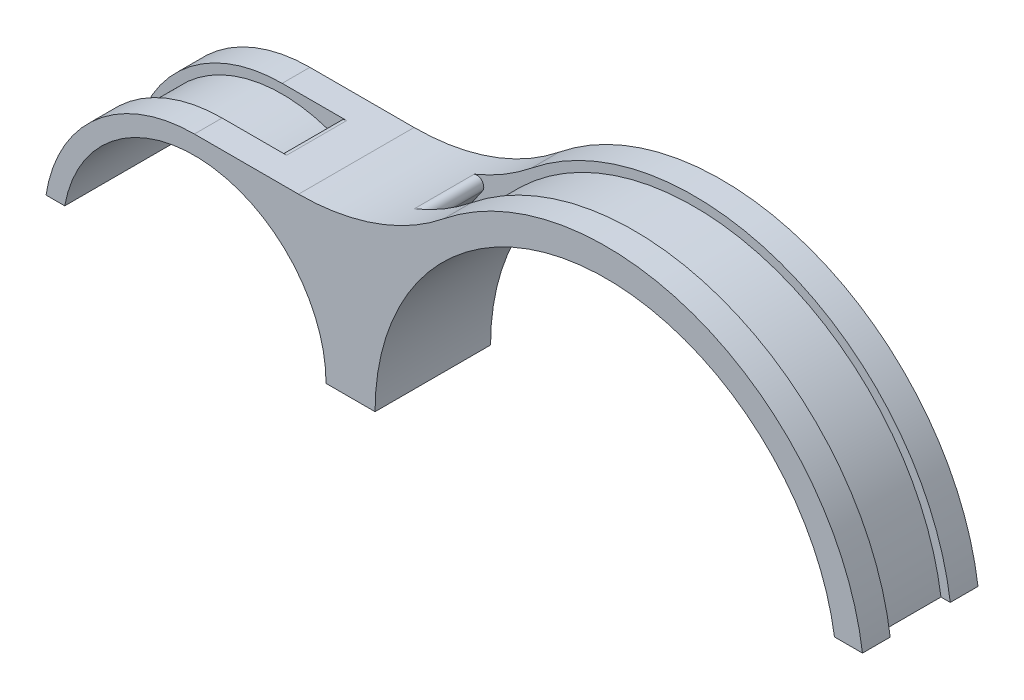
ISO-10303-21;
HEADER;
FILE_DESCRIPTION(('STEP AP214'),'2;1');
FILE_NAME('part.step','',(''),(''),'','','');
FILE_SCHEMA(('AUTOMOTIVE_DESIGN { 1 0 10303 214 1 1 1 1 }'));
ENDSEC;
DATA;
#1=APPLICATION_CONTEXT('core data for automotive mechanical design processes');
#2=APPLICATION_PROTOCOL_DEFINITION('international standard','automotive_design',2000,#1);
#3=PRODUCT_CONTEXT('',#1,'mechanical');
#4=PRODUCT('Part','Part','',(#3));
#5=PRODUCT_RELATED_PRODUCT_CATEGORY('part','',(#4));
#6=PRODUCT_DEFINITION_FORMATION('','',#4);
#7=PRODUCT_DEFINITION_CONTEXT('part definition',#1,'design');
#8=PRODUCT_DEFINITION('design','',#6,#7);
#9=PRODUCT_DEFINITION_SHAPE('','',#8);
#10=(LENGTH_UNIT() NAMED_UNIT(*) SI_UNIT(.MILLI.,.METRE.));
#11=(NAMED_UNIT(*) PLANE_ANGLE_UNIT() SI_UNIT($,.RADIAN.));
#12=(NAMED_UNIT(*) SI_UNIT($,.STERADIAN.) SOLID_ANGLE_UNIT());
#13=UNCERTAINTY_MEASURE_WITH_UNIT(LENGTH_MEASURE(1.E-05),#10,'distance_accuracy_value','');
#14=(GEOMETRIC_REPRESENTATION_CONTEXT(3) GLOBAL_UNCERTAINTY_ASSIGNED_CONTEXT((#13)) GLOBAL_UNIT_ASSIGNED_CONTEXT((#10,
#11,#12)) REPRESENTATION_CONTEXT('',''));
#15=CARTESIAN_POINT('',(0.,0.,0.));
#16=DIRECTION('',(0.,0.,1.));
#17=DIRECTION('',(1.,0.,0.));
#18=AXIS2_PLACEMENT_3D('',#15,#16,#17);
#19=CARTESIAN_POINT('',(0.,0.,12.5));
#20=DIRECTION('',(0.,0.,1.));
#21=DIRECTION('',(1.,0.,0.));
#22=AXIS2_PLACEMENT_3D('',#19,#20,#21);
#23=PLANE('',#22);
#24=CARTESIAN_POINT('',(-89.1042761152943,0.,12.5));
#25=DIRECTION('',(0.,0.,1.));
#26=DIRECTION('',(1.,0.,0.));
#27=AXIS2_PLACEMENT_3D('',#24,#25,#26);
#28=CIRCLE('',#27,28.5);
#29=CARTESIAN_POINT('',(-60.6042761152943,0.,12.5));
#30=VERTEX_POINT('',#29);
#31=CARTESIAN_POINT('',(-117.162251808491,5.,12.5));
#32=VERTEX_POINT('',#31);
#33=EDGE_CURVE('E220',#30,#32,#28,.T.);
#34=ORIENTED_EDGE('',*,*,#33,.F.);
#35=DIRECTION('',(1.,0.,0.));
#36=VECTOR('',#35,1.);
#37=CARTESIAN_POINT('',(0.,0.,12.5));
#38=LINE('',#37,#36);
#39=CARTESIAN_POINT('',(-50.,0.,12.5));
#40=VERTEX_POINT('',#39);
#41=EDGE_CURVE('E50',#30,#40,#38,.T.);
#42=ORIENTED_EDGE('',*,*,#41,.T.);
#43=CARTESIAN_POINT('',(0.,0.,12.5));
#44=DIRECTION('',(0.,0.,1.));
#45=DIRECTION('',(1.,0.,0.));
#46=AXIS2_PLACEMENT_3D('',#43,#44,#45);
#47=CIRCLE('',#46,50.);
#48=CARTESIAN_POINT('',(49.434299833213,7.5,12.5));
#49=VERTEX_POINT('',#48);
#50=EDGE_CURVE('E251',#49,#40,#47,.T.);
#51=ORIENTED_EDGE('',*,*,#50,.F.);
#52=DIRECTION('',(-1.,0.,0.));
#53=VECTOR('',#52,1.);
#54=CARTESIAN_POINT('',(56.,7.5,12.5));
#55=LINE('',#54,#53);
#56=CARTESIAN_POINT('',(55.4954953126828,7.5,12.5));
#57=VERTEX_POINT('',#56);
#58=EDGE_CURVE('E379',#57,#49,#55,.T.);
#59=ORIENTED_EDGE('',*,*,#58,.F.);
#60=CARTESIAN_POINT('',(0.,0.,12.5));
#61=DIRECTION('',(0.,0.,1.));
#62=DIRECTION('',(1.,0.,0.));
#63=AXIS2_PLACEMENT_3D('',#60,#61,#62);
#64=CIRCLE('',#63,56.);
#65=CARTESIAN_POINT('',(-35.1618543108296,43.5849056603773,12.5));
#66=VERTEX_POINT('',#65);
#67=EDGE_CURVE('E257',#57,#66,#64,.T.);
#68=ORIENTED_EDGE('',*,*,#67,.T.);
#69=CARTESIAN_POINT('',(-66.5563670883561,82.5,12.5));
#70=DIRECTION('',(0.,0.,1.));
#71=DIRECTION('',(1.,0.,0.));
#72=AXIS2_PLACEMENT_3D('',#69,#70,#71);
#73=CIRCLE('',#72,50.);
#74=CARTESIAN_POINT('',(-66.5563670883561,32.5,12.5));
#75=VERTEX_POINT('',#74);
#76=EDGE_CURVE('E277',#66,#75,#73,.F.);
#77=ORIENTED_EDGE('',*,*,#76,.T.);
#78=DIRECTION('',(-1.,0.,0.));
#79=VECTOR('',#78,1.);
#80=CARTESIAN_POINT('',(-45.6042761152943,32.5,12.5));
#81=LINE('',#80,#79);
#82=CARTESIAN_POINT('',(-89.1042761152943,32.5,12.5));
#83=VERTEX_POINT('',#82);
#84=EDGE_CURVE('E246',#75,#83,#81,.T.);
#85=ORIENTED_EDGE('',*,*,#84,.T.);
#86=CARTESIAN_POINT('',(-89.1042761152943,0.,12.5));
#87=DIRECTION('',(0.,0.,1.));
#88=DIRECTION('',(1.,0.,0.));
#89=AXIS2_PLACEMENT_3D('',#86,#87,#88);
#90=CIRCLE('',#89,32.5);
#91=CARTESIAN_POINT('',(-121.217357561957,5.,12.5));
#92=VERTEX_POINT('',#91);
#93=EDGE_CURVE('E242',#83,#92,#90,.T.);
#94=ORIENTED_EDGE('',*,*,#93,.T.);
#95=DIRECTION('',(1.,0.,0.));
#96=VECTOR('',#95,1.);
#97=CARTESIAN_POINT('',(-117.162251808491,5.,12.5));
#98=LINE('',#97,#96);
#99=EDGE_CURVE('E333',#92,#32,#98,.T.);
#100=ORIENTED_EDGE('',*,*,#99,.T.);
#101=EDGE_LOOP('',(#34,#42,#51,#59,#68,#77,#85,#94,#100));
#102=FACE_BOUND('',#101,.T.);
#103=ADVANCED_FACE('F35',(#102),#23,.T.);
#104=CARTESIAN_POINT('',(0.,0.,-12.5));
#105=DIRECTION('',(0.,0.,1.));
#106=DIRECTION('',(1.,0.,0.));
#107=AXIS2_PLACEMENT_3D('',#104,#105,#106);
#108=PLANE('',#107);
#109=DIRECTION('',(1.,0.,0.));
#110=VECTOR('',#109,1.);
#111=CARTESIAN_POINT('',(0.,0.,-12.5));
#112=LINE('',#111,#110);
#113=CARTESIAN_POINT('',(-60.6042761152943,0.,-12.5));
#114=VERTEX_POINT('',#113);
#115=CARTESIAN_POINT('',(-50.,0.,-12.5));
#116=VERTEX_POINT('',#115);
#117=EDGE_CURVE('E385',#114,#116,#112,.T.);
#118=ORIENTED_EDGE('',*,*,#117,.F.);
#119=CARTESIAN_POINT('',(-89.1042761152943,0.,-12.5));
#120=DIRECTION('',(0.,0.,1.));
#121=DIRECTION('',(1.,0.,0.));
#122=AXIS2_PLACEMENT_3D('',#119,#120,#121);
#123=CIRCLE('',#122,28.5);
#124=CARTESIAN_POINT('',(-117.162251808491,5.,-12.5));
#125=VERTEX_POINT('',#124);
#126=EDGE_CURVE('E222',#114,#125,#123,.T.);
#127=ORIENTED_EDGE('',*,*,#126,.T.);
#128=DIRECTION('',(1.,0.,0.));
#129=VECTOR('',#128,1.);
#130=CARTESIAN_POINT('',(-117.162251808491,5.,-12.5));
#131=LINE('',#130,#129);
#132=CARTESIAN_POINT('',(-121.217357561957,5.,-12.5));
#133=VERTEX_POINT('',#132);
#134=EDGE_CURVE('E348',#133,#125,#131,.T.);
#135=ORIENTED_EDGE('',*,*,#134,.F.);
#136=CARTESIAN_POINT('',(-89.1042761152943,0.,-12.5));
#137=DIRECTION('',(0.,0.,1.));
#138=DIRECTION('',(1.,0.,0.));
#139=AXIS2_PLACEMENT_3D('',#136,#137,#138);
#140=CIRCLE('',#139,32.5);
#141=CARTESIAN_POINT('',(-89.1042761152943,32.5,-12.5));
#142=VERTEX_POINT('',#141);
#143=EDGE_CURVE('E236',#133,#142,#140,.F.);
#144=ORIENTED_EDGE('',*,*,#143,.T.);
#145=DIRECTION('',(1.,0.,0.));
#146=VECTOR('',#145,1.);
#147=CARTESIAN_POINT('',(-45.6042761152943,32.5,-12.5));
#148=LINE('',#147,#146);
#149=CARTESIAN_POINT('',(-66.5563670883561,32.5,-12.5));
#150=VERTEX_POINT('',#149);
#151=EDGE_CURVE('E238',#142,#150,#148,.T.);
#152=ORIENTED_EDGE('',*,*,#151,.T.);
#153=CARTESIAN_POINT('',(-66.5563670883561,82.5,-12.5));
#154=DIRECTION('',(0.,0.,1.));
#155=DIRECTION('',(1.,0.,0.));
#156=AXIS2_PLACEMENT_3D('',#153,#154,#155);
#157=CIRCLE('',#156,50.);
#158=CARTESIAN_POINT('',(-35.1618543108296,43.5849056603773,-12.5));
#159=VERTEX_POINT('',#158);
#160=EDGE_CURVE('E269',#150,#159,#157,.T.);
#161=ORIENTED_EDGE('',*,*,#160,.T.);
#162=CARTESIAN_POINT('',(0.,0.,-12.5));
#163=DIRECTION('',(0.,0.,1.));
#164=DIRECTION('',(1.,0.,0.));
#165=AXIS2_PLACEMENT_3D('',#162,#163,#164);
#166=CIRCLE('',#165,56.);
#167=CARTESIAN_POINT('',(55.4954953126828,7.5,-12.5));
#168=VERTEX_POINT('',#167);
#169=EDGE_CURVE('E254',#168,#159,#166,.T.);
#170=ORIENTED_EDGE('',*,*,#169,.F.);
#171=DIRECTION('',(-1.,0.,0.));
#172=VECTOR('',#171,1.);
#173=CARTESIAN_POINT('',(56.,7.5,-12.5));
#174=LINE('',#173,#172);
#175=CARTESIAN_POINT('',(49.434299833213,7.5,-12.5));
#176=VERTEX_POINT('',#175);
#177=EDGE_CURVE('E376',#168,#176,#174,.T.);
#178=ORIENTED_EDGE('',*,*,#177,.T.);
#179=CARTESIAN_POINT('',(0.,0.,-12.5));
#180=DIRECTION('',(0.,0.,1.));
#181=DIRECTION('',(1.,0.,0.));
#182=AXIS2_PLACEMENT_3D('',#179,#180,#181);
#183=CIRCLE('',#182,50.);
#184=EDGE_CURVE('E245',#176,#116,#183,.T.);
#185=ORIENTED_EDGE('',*,*,#184,.T.);
#186=EDGE_LOOP('',(#118,#127,#135,#144,#152,#161,#170,#178,#185));
#187=FACE_BOUND('',#186,.T.);
#188=ADVANCED_FACE('F343',(#187),#108,.F.);
#189=CARTESIAN_POINT('',(0.,0.,12.5));
#190=DIRECTION('',(0.,0.,-1.));
#191=DIRECTION('',(-1.,0.,0.));
#192=AXIS2_PLACEMENT_3D('',#189,#190,#191);
#193=CYLINDRICAL_SURFACE('',#192,50.);
#194=ORIENTED_EDGE('',*,*,#50,.T.);
#195=DIRECTION('',(0.,0.,-1.));
#196=VECTOR('',#195,1.);
#197=CARTESIAN_POINT('',(-50.,0.,12.5));
#198=LINE('',#197,#196);
#199=EDGE_CURVE('E381',#40,#116,#198,.T.);
#200=ORIENTED_EDGE('',*,*,#199,.T.);
#201=ORIENTED_EDGE('',*,*,#184,.F.);
#202=DIRECTION('',(0.,0.,-1.));
#203=VECTOR('',#202,1.);
#204=CARTESIAN_POINT('',(49.434299833213,7.5,12.5));
#205=LINE('',#204,#203);
#206=EDGE_CURVE('E363',#176,#49,#205,.F.);
#207=ORIENTED_EDGE('',*,*,#206,.T.);
#208=EDGE_LOOP('',(#194,#200,#201,#207));
#209=FACE_BOUND('',#208,.T.);
#210=ADVANCED_FACE('F402',(#209),#193,.F.);
#211=CARTESIAN_POINT('',(0.,0.,-6.5));
#212=DIRECTION('',(0.,0.,1.));
#213=DIRECTION('',(1.,0.,0.));
#214=AXIS2_PLACEMENT_3D('',#211,#212,#213);
#215=PLANE('',#214);
#216=CARTESIAN_POINT('',(-89.1042761152943,0.,-6.5));
#217=DIRECTION('',(0.,0.,1.));
#218=DIRECTION('',(1.,0.,0.));
#219=AXIS2_PLACEMENT_3D('',#216,#217,#218);
#220=CIRCLE('',#219,30.5);
#221=CARTESIAN_POINT('',(-58.6042761152943,0.,-6.5));
#222=VERTEX_POINT('',#221);
#223=CARTESIAN_POINT('',(-119.191648881955,5.,-6.5));
#224=VERTEX_POINT('',#223);
#225=EDGE_CURVE('E201',#222,#224,#220,.T.);
#226=ORIENTED_EDGE('',*,*,#225,.F.);
#227=DIRECTION('',(1.,0.,0.));
#228=VECTOR('',#227,1.);
#229=CARTESIAN_POINT('',(0.,0.,-6.5));
#230=LINE('',#229,#228);
#231=CARTESIAN_POINT('',(-54.,0.,-6.5));
#232=VERTEX_POINT('',#231);
#233=EDGE_CURVE('E58',#222,#232,#230,.T.);
#234=ORIENTED_EDGE('',*,*,#233,.T.);
#235=CARTESIAN_POINT('',(0.,0.,-6.5));
#236=DIRECTION('',(0.,0.,1.));
#237=DIRECTION('',(1.,0.,0.));
#238=AXIS2_PLACEMENT_3D('',#235,#236,#237);
#239=CIRCLE('',#238,54.);
#240=CARTESIAN_POINT('',(53.4766304099277,7.5,-6.5));
#241=VERTEX_POINT('',#240);
#242=EDGE_CURVE('E224',#241,#232,#239,.T.);
#243=ORIENTED_EDGE('',*,*,#242,.F.);
#244=DIRECTION('',(1.,0.,0.));
#245=VECTOR('',#244,1.);
#246=CARTESIAN_POINT('',(0.,7.5,-6.5));
#247=LINE('',#246,#245);
#248=CARTESIAN_POINT('',(55.4954953126828,7.5,-6.5));
#249=VERTEX_POINT('',#248);
#250=EDGE_CURVE('E371',#241,#249,#247,.T.);
#251=ORIENTED_EDGE('',*,*,#250,.T.);
#252=CARTESIAN_POINT('',(0.,0.,-6.5));
#253=DIRECTION('',(0.,0.,1.));
#254=DIRECTION('',(1.,0.,0.));
#255=AXIS2_PLACEMENT_3D('',#252,#253,#254);
#256=CIRCLE('',#255,56.);
#257=CARTESIAN_POINT('',(-35.1618543108296,43.5849056603773,-6.5));
#258=VERTEX_POINT('',#257);
#259=EDGE_CURVE('E234',#249,#258,#256,.T.);
#260=ORIENTED_EDGE('',*,*,#259,.T.);
#261=CARTESIAN_POINT('',(-66.5563670883561,82.5,-6.5));
#262=DIRECTION('',(0.,0.,1.));
#263=DIRECTION('',(1.,0.,0.));
#264=AXIS2_PLACEMENT_3D('',#261,#262,#263);
#265=CIRCLE('',#264,50.);
#266=CARTESIAN_POINT('',(-47.5428205284511,36.2562431541908,-6.5));
#267=VERTEX_POINT('',#266);
#268=EDGE_CURVE('E272',#258,#267,#265,.F.);
#269=ORIENTED_EDGE('',*,*,#268,.T.);
#270=CARTESIAN_POINT('',(-46.9724141316539,34.8689304488165,-6.5));
#271=DIRECTION('',(0.,0.,1.));
#272=DIRECTION('',(1.,0.,0.));
#273=AXIS2_PLACEMENT_3D('',#270,#271,#272);
#274=CIRCLE('',#273,1.5);
#275=CARTESIAN_POINT('',(-45.7679932564833,33.9748553091032,-6.5));
#276=VERTEX_POINT('',#275);
#277=EDGE_CURVE('E302',#267,#276,#274,.F.);
#278=ORIENTED_EDGE('',*,*,#277,.T.);
#279=CARTESIAN_POINT('',(0.,0.,-6.5));
#280=DIRECTION('',(0.,0.,1.));
#281=DIRECTION('',(1.,0.,0.));
#282=AXIS2_PLACEMENT_3D('',#279,#280,#281);
#283=CIRCLE('',#282,57.);
#284=CARTESIAN_POINT('',(-56.8565419291445,4.04148980691904,-6.5));
#285=VERTEX_POINT('',#284);
#286=EDGE_CURVE('E229',#276,#285,#283,.T.);
#287=ORIENTED_EDGE('',*,*,#286,.T.);
#288=CARTESIAN_POINT('',(-89.1042761152943,0.,-6.5));
#289=DIRECTION('',(0.,0.,1.));
#290=DIRECTION('',(1.,0.,0.));
#291=AXIS2_PLACEMENT_3D('',#288,#289,#290);
#292=CIRCLE('',#291,32.5);
#293=CARTESIAN_POINT('',(-75.756105485221,29.6323529411765,-6.5));
#294=VERTEX_POINT('',#293);
#295=EDGE_CURVE('E210',#285,#294,#292,.T.);
#296=ORIENTED_EDGE('',*,*,#295,.T.);
#297=CARTESIAN_POINT('',(-75.1400360715253,31.,-6.5));
#298=DIRECTION('',(0.,0.,1.));
#299=DIRECTION('',(1.,0.,0.));
#300=AXIS2_PLACEMENT_3D('',#297,#298,#299);
#301=CIRCLE('',#300,1.5);
#302=CARTESIAN_POINT('',(-75.1400360715253,32.5,-6.5));
#303=VERTEX_POINT('',#302);
#304=EDGE_CURVE('E43',#294,#303,#301,.F.);
#305=ORIENTED_EDGE('',*,*,#304,.T.);
#306=DIRECTION('',(1.,0.,0.));
#307=VECTOR('',#306,1.);
#308=CARTESIAN_POINT('',(0.,32.5,-6.5));
#309=LINE('',#308,#307);
#310=CARTESIAN_POINT('',(-89.1042761152943,32.5,-6.5));
#311=VERTEX_POINT('',#310);
#312=EDGE_CURVE('E289',#311,#303,#309,.T.);
#313=ORIENTED_EDGE('',*,*,#312,.F.);
#314=CARTESIAN_POINT('',(-121.217357561957,5.,-6.5));
#315=VERTEX_POINT('',#314);
#316=EDGE_CURVE('E214',#311,#315,#292,.T.);
#317=ORIENTED_EDGE('',*,*,#316,.T.);
#318=DIRECTION('',(-1.,0.,0.));
#319=VECTOR('',#318,1.);
#320=CARTESIAN_POINT('',(0.,5.,-6.5));
#321=LINE('',#320,#319);
#322=EDGE_CURVE('E352',#224,#315,#321,.T.);
#323=ORIENTED_EDGE('',*,*,#322,.F.);
#324=EDGE_LOOP('',(#226,#234,#243,#251,#260,#269,#278,#287,#296,#305,#313,#317,#323));
#325=FACE_BOUND('',#324,.T.);
#326=ADVANCED_FACE('F307',(#325),#215,.T.);
#327=CARTESIAN_POINT('',(0.,0.,6.5));
#328=DIRECTION('',(0.,0.,1.));
#329=DIRECTION('',(1.,0.,0.));
#330=AXIS2_PLACEMENT_3D('',#327,#328,#329);
#331=PLANE('',#330);
#332=DIRECTION('',(1.,0.,0.));
#333=VECTOR('',#332,1.);
#334=CARTESIAN_POINT('',(0.,0.,6.5));
#335=LINE('',#334,#333);
#336=CARTESIAN_POINT('',(-58.6042761152943,0.,6.5));
#337=VERTEX_POINT('',#336);
#338=CARTESIAN_POINT('',(-54.,0.,6.5));
#339=VERTEX_POINT('',#338);
#340=EDGE_CURVE('E182',#337,#339,#335,.T.);
#341=ORIENTED_EDGE('',*,*,#340,.F.);
#342=CARTESIAN_POINT('',(-89.1042761152943,0.,6.5));
#343=DIRECTION('',(0.,0.,1.));
#344=DIRECTION('',(1.,0.,0.));
#345=AXIS2_PLACEMENT_3D('',#342,#343,#344);
#346=CIRCLE('',#345,30.5);
#347=CARTESIAN_POINT('',(-119.191648881955,5.,6.5));
#348=VERTEX_POINT('',#347);
#349=EDGE_CURVE('E191',#337,#348,#346,.T.);
#350=ORIENTED_EDGE('',*,*,#349,.T.);
#351=DIRECTION('',(-1.,0.,0.));
#352=VECTOR('',#351,1.);
#353=CARTESIAN_POINT('',(0.,5.,6.5));
#354=LINE('',#353,#352);
#355=CARTESIAN_POINT('',(-121.217357561957,5.,6.5));
#356=VERTEX_POINT('',#355);
#357=EDGE_CURVE('E354',#348,#356,#354,.T.);
#358=ORIENTED_EDGE('',*,*,#357,.T.);
#359=CARTESIAN_POINT('',(-89.1042761152943,0.,6.5));
#360=DIRECTION('',(0.,0.,1.));
#361=DIRECTION('',(1.,0.,0.));
#362=AXIS2_PLACEMENT_3D('',#359,#360,#361);
#363=CIRCLE('',#362,32.5);
#364=CARTESIAN_POINT('',(-89.1042761152943,32.5,6.5));
#365=VERTEX_POINT('',#364);
#366=EDGE_CURVE('E204',#365,#356,#363,.T.);
#367=ORIENTED_EDGE('',*,*,#366,.F.);
#368=DIRECTION('',(-1.,0.,0.));
#369=VECTOR('',#368,1.);
#370=CARTESIAN_POINT('',(-45.6042761152943,32.5,6.50000000000001));
#371=LINE('',#370,#369);
#372=CARTESIAN_POINT('',(-75.1400360715253,32.5,6.5));
#373=VERTEX_POINT('',#372);
#374=EDGE_CURVE('E295',#373,#365,#371,.T.);
#375=ORIENTED_EDGE('',*,*,#374,.F.);
#376=CARTESIAN_POINT('',(-75.1400360715253,31.,6.5));
#377=DIRECTION('',(0.,0.,1.));
#378=DIRECTION('',(1.,0.,0.));
#379=AXIS2_PLACEMENT_3D('',#376,#377,#378);
#380=CIRCLE('',#379,1.5);
#381=CARTESIAN_POINT('',(-75.756105485221,29.6323529411765,6.5));
#382=VERTEX_POINT('',#381);
#383=EDGE_CURVE('E304',#373,#382,#380,.T.);
#384=ORIENTED_EDGE('',*,*,#383,.T.);
#385=CARTESIAN_POINT('',(-56.8565419291445,4.04148980691904,6.5));
#386=VERTEX_POINT('',#385);
#387=EDGE_CURVE('E215',#386,#382,#363,.T.);
#388=ORIENTED_EDGE('',*,*,#387,.F.);
#389=CARTESIAN_POINT('',(0.,0.,6.5));
#390=DIRECTION('',(0.,0.,1.));
#391=DIRECTION('',(1.,0.,0.));
#392=AXIS2_PLACEMENT_3D('',#389,#390,#391);
#393=CIRCLE('',#392,57.);
#394=CARTESIAN_POINT('',(-45.7679932564833,33.9748553091032,6.5));
#395=VERTEX_POINT('',#394);
#396=EDGE_CURVE('E227',#395,#386,#393,.T.);
#397=ORIENTED_EDGE('',*,*,#396,.F.);
#398=CARTESIAN_POINT('',(-46.9724141316539,34.8689304488165,6.5));
#399=DIRECTION('',(0.,0.,1.));
#400=DIRECTION('',(1.,0.,0.));
#401=AXIS2_PLACEMENT_3D('',#398,#399,#400);
#402=CIRCLE('',#401,1.5);
#403=CARTESIAN_POINT('',(-47.5428205284511,36.2562431541908,6.5));
#404=VERTEX_POINT('',#403);
#405=EDGE_CURVE('E299',#395,#404,#402,.T.);
#406=ORIENTED_EDGE('',*,*,#405,.T.);
#407=CARTESIAN_POINT('',(-66.5563670883561,82.5,6.5));
#408=DIRECTION('',(0.,0.,1.));
#409=DIRECTION('',(1.,0.,0.));
#410=AXIS2_PLACEMENT_3D('',#407,#408,#409);
#411=CIRCLE('',#410,50.);
#412=CARTESIAN_POINT('',(-35.1618543108296,43.5849056603773,6.5));
#413=VERTEX_POINT('',#412);
#414=EDGE_CURVE('E274',#404,#413,#411,.T.);
#415=ORIENTED_EDGE('',*,*,#414,.T.);
#416=CARTESIAN_POINT('',(0.,0.,6.5));
#417=DIRECTION('',(0.,0.,1.));
#418=DIRECTION('',(1.,0.,0.));
#419=AXIS2_PLACEMENT_3D('',#416,#417,#418);
#420=CIRCLE('',#419,56.);
#421=CARTESIAN_POINT('',(55.4954953126828,7.5,6.5));
#422=VERTEX_POINT('',#421);
#423=EDGE_CURVE('E231',#422,#413,#420,.T.);
#424=ORIENTED_EDGE('',*,*,#423,.F.);
#425=DIRECTION('',(1.,0.,0.));
#426=VECTOR('',#425,1.);
#427=CARTESIAN_POINT('',(0.,7.5,6.5));
#428=LINE('',#427,#426);
#429=CARTESIAN_POINT('',(53.4766304099276,7.5,6.5));
#430=VERTEX_POINT('',#429);
#431=EDGE_CURVE('E374',#430,#422,#428,.T.);
#432=ORIENTED_EDGE('',*,*,#431,.F.);
#433=CARTESIAN_POINT('',(0.,0.,6.5));
#434=DIRECTION('',(0.,0.,1.));
#435=DIRECTION('',(1.,0.,0.));
#436=AXIS2_PLACEMENT_3D('',#433,#434,#435);
#437=CIRCLE('',#436,54.);
#438=EDGE_CURVE('E195',#430,#339,#437,.T.);
#439=ORIENTED_EDGE('',*,*,#438,.T.);
#440=EDGE_LOOP('',(#341,#350,#358,#367,#375,#384,#388,#397,#406,#415,#424,#432,#439));
#441=FACE_BOUND('',#440,.T.);
#442=ADVANCED_FACE('F189',(#441),#331,.F.);
#443=CARTESIAN_POINT('',(0.,0.,-6.5));
#444=DIRECTION('',(0.,0.,1.));
#445=DIRECTION('',(1.,0.,0.));
#446=AXIS2_PLACEMENT_3D('',#443,#444,#445);
#447=CYLINDRICAL_SURFACE('',#446,54.);
#448=ORIENTED_EDGE('',*,*,#242,.T.);
#449=DIRECTION('',(0.,0.,1.));
#450=VECTOR('',#449,1.);
#451=CARTESIAN_POINT('',(-54.,0.,-6.5));
#452=LINE('',#451,#450);
#453=EDGE_CURVE('E389',#232,#339,#452,.T.);
#454=ORIENTED_EDGE('',*,*,#453,.T.);
#455=ORIENTED_EDGE('',*,*,#438,.F.);
#456=DIRECTION('',(0.,0.,1.));
#457=VECTOR('',#456,1.);
#458=CARTESIAN_POINT('',(53.4766304099276,7.5,-6.5));
#459=LINE('',#458,#457);
#460=EDGE_CURVE('E280',#430,#241,#459,.F.);
#461=ORIENTED_EDGE('',*,*,#460,.T.);
#462=EDGE_LOOP('',(#448,#454,#455,#461));
#463=FACE_BOUND('',#462,.T.);
#464=ADVANCED_FACE('F393',(#463),#447,.T.);
#465=CARTESIAN_POINT('',(-89.1042761152943,0.,-12.5));
#466=DIRECTION('',(0.,0.,1.));
#467=DIRECTION('',(1.,0.,0.));
#468=AXIS2_PLACEMENT_3D('',#465,#466,#467);
#469=CYLINDRICAL_SURFACE('',#468,28.5);
#470=DIRECTION('',(0.,0.,1.));
#471=VECTOR('',#470,1.);
#472=CARTESIAN_POINT('',(-60.6042761152943,0.,-12.5));
#473=LINE('',#472,#471);
#474=EDGE_CURVE('E387',#30,#114,#473,.F.);
#475=ORIENTED_EDGE('',*,*,#474,.F.);
#476=ORIENTED_EDGE('',*,*,#33,.T.);
#477=DIRECTION('',(0.,0.,-1.));
#478=VECTOR('',#477,1.);
#479=CARTESIAN_POINT('',(-117.162251808491,5.,12.5));
#480=LINE('',#479,#478);
#481=EDGE_CURVE('E357',#32,#125,#480,.T.);
#482=ORIENTED_EDGE('',*,*,#481,.T.);
#483=ORIENTED_EDGE('',*,*,#126,.F.);
#484=EDGE_LOOP('',(#475,#476,#482,#483));
#485=FACE_BOUND('',#484,.T.);
#486=ADVANCED_FACE('F454',(#485),#469,.F.);
#487=CARTESIAN_POINT('',(-89.1042761152943,0.,-6.5));
#488=DIRECTION('',(0.,0.,1.));
#489=DIRECTION('',(1.,0.,0.));
#490=AXIS2_PLACEMENT_3D('',#487,#488,#489);
#491=CYLINDRICAL_SURFACE('',#490,30.5);
#492=ORIENTED_EDGE('',*,*,#349,.F.);
#493=DIRECTION('',(0.,0.,1.));
#494=VECTOR('',#493,1.);
#495=CARTESIAN_POINT('',(-58.6042761152943,0.,-6.5));
#496=LINE('',#495,#494);
#497=EDGE_CURVE('E11',#337,#222,#496,.F.);
#498=ORIENTED_EDGE('',*,*,#497,.T.);
#499=ORIENTED_EDGE('',*,*,#225,.T.);
#500=DIRECTION('',(0.,0.,1.));
#501=VECTOR('',#500,1.);
#502=CARTESIAN_POINT('',(-119.191648881955,5.,-6.5));
#503=LINE('',#502,#501);
#504=EDGE_CURVE('E200',#348,#224,#503,.F.);
#505=ORIENTED_EDGE('',*,*,#504,.F.);
#506=EDGE_LOOP('',(#492,#498,#499,#505));
#507=FACE_BOUND('',#506,.T.);
#508=ADVANCED_FACE('F198',(#507),#491,.T.);
#509=CARTESIAN_POINT('',(0.,0.,12.5));
#510=DIRECTION('',(0.,0.,-1.));
#511=DIRECTION('',(-1.,0.,0.));
#512=AXIS2_PLACEMENT_3D('',#509,#510,#511);
#513=CYLINDRICAL_SURFACE('',#512,56.);
#514=DIRECTION('',(0.,0.,-1.));
#515=VECTOR('',#514,1.);
#516=CARTESIAN_POINT('',(55.4954953126828,7.5,12.5));
#517=LINE('',#516,#515);
#518=EDGE_CURVE('E367',#168,#249,#517,.F.);
#519=ORIENTED_EDGE('',*,*,#518,.F.);
#520=ORIENTED_EDGE('',*,*,#169,.T.);
#521=DIRECTION('',(0.,0.,-1.));
#522=VECTOR('',#521,1.);
#523=CARTESIAN_POINT('',(-35.1618543108296,43.5849056603773,12.5));
#524=LINE('',#523,#522);
#525=EDGE_CURVE('E263',#159,#258,#524,.F.);
#526=ORIENTED_EDGE('',*,*,#525,.T.);
#527=ORIENTED_EDGE('',*,*,#259,.F.);
#528=EDGE_LOOP('',(#519,#520,#526,#527));
#529=FACE_BOUND('',#528,.T.);
#530=ADVANCED_FACE('F406',(#529),#513,.T.);
#531=DIRECTION('',(0.,0.,-1.));
#532=VECTOR('',#531,1.);
#533=CARTESIAN_POINT('',(55.4954953126828,7.5,12.5));
#534=LINE('',#533,#532);
#535=EDGE_CURVE('E369',#422,#57,#534,.F.);
#536=ORIENTED_EDGE('',*,*,#535,.F.);
#537=ORIENTED_EDGE('',*,*,#423,.T.);
#538=DIRECTION('',(0.,0.,-1.));
#539=VECTOR('',#538,1.);
#540=CARTESIAN_POINT('',(-35.1618543108296,43.5849056603773,9.5));
#541=LINE('',#540,#539);
#542=EDGE_CURVE('E259',#413,#66,#541,.F.);
#543=ORIENTED_EDGE('',*,*,#542,.T.);
#544=ORIENTED_EDGE('',*,*,#67,.F.);
#545=EDGE_LOOP('',(#536,#537,#543,#544));
#546=FACE_BOUND('',#545,.T.);
#547=ADVANCED_FACE('F399',(#546),#513,.T.);
#548=CARTESIAN_POINT('',(-89.1042761152943,0.,112.504999875006));
#549=DIRECTION('',(0.,0.,-1.));
#550=DIRECTION('',(-1.,0.,0.));
#551=AXIS2_PLACEMENT_3D('',#548,#549,#550);
#552=CYLINDRICAL_SURFACE('',#551,32.5);
#553=ORIENTED_EDGE('',*,*,#143,.F.);
#554=DIRECTION('',(0.,0.,-1.));
#555=VECTOR('',#554,1.);
#556=CARTESIAN_POINT('',(-121.217357561957,5.,112.504999875006));
#557=LINE('',#556,#555);
#558=EDGE_CURVE('E202',#133,#315,#557,.F.);
#559=ORIENTED_EDGE('',*,*,#558,.T.);
#560=ORIENTED_EDGE('',*,*,#316,.F.);
#561=DIRECTION('',(0.,0.,-1.));
#562=VECTOR('',#561,1.);
#563=CARTESIAN_POINT('',(-89.1042761152943,32.5,112.504999875006));
#564=LINE('',#563,#562);
#565=EDGE_CURVE('E241',#311,#142,#564,.T.);
#566=ORIENTED_EDGE('',*,*,#565,.T.);
#567=EDGE_LOOP('',(#553,#559,#560,#566));
#568=FACE_BOUND('',#567,.T.);
#569=ADVANCED_FACE('F350',(#568),#552,.T.);
#570=ORIENTED_EDGE('',*,*,#366,.T.);
#571=DIRECTION('',(0.,0.,-1.));
#572=VECTOR('',#571,1.);
#573=CARTESIAN_POINT('',(-121.217357561957,5.,112.504999875006));
#574=LINE('',#573,#572);
#575=EDGE_CURVE('E207',#356,#92,#574,.F.);
#576=ORIENTED_EDGE('',*,*,#575,.T.);
#577=ORIENTED_EDGE('',*,*,#93,.F.);
#578=EDGE_CURVE('E248',#83,#365,#564,.T.);
#579=ORIENTED_EDGE('',*,*,#578,.T.);
#580=EDGE_LOOP('',(#570,#576,#577,#579));
#581=FACE_BOUND('',#580,.T.);
#582=ADVANCED_FACE('F328',(#581),#552,.T.);
#583=CARTESIAN_POINT('',(-45.6042761152943,32.5,112.504999875006));
#584=DIRECTION('',(0.,-1.,0.));
#585=DIRECTION('',(1.,0.,0.));
#586=AXIS2_PLACEMENT_3D('',#583,#584,#585);
#587=PLANE('',#586);
#588=DIRECTION('',(0.,0.,1.));
#589=VECTOR('',#588,1.);
#590=CARTESIAN_POINT('',(-75.1400360715253,32.5,112.504999875006));
#591=LINE('',#590,#589);
#592=EDGE_CURVE('E292',#303,#373,#591,.T.);
#593=ORIENTED_EDGE('',*,*,#592,.T.);
#594=ORIENTED_EDGE('',*,*,#374,.T.);
#595=ORIENTED_EDGE('',*,*,#578,.F.);
#596=ORIENTED_EDGE('',*,*,#84,.F.);
#597=DIRECTION('',(0.,0.,1.));
#598=VECTOR('',#597,1.);
#599=CARTESIAN_POINT('',(-66.5563670883561,32.5,-12.5));
#600=LINE('',#599,#598);
#601=EDGE_CURVE('E266',#75,#150,#600,.F.);
#602=ORIENTED_EDGE('',*,*,#601,.T.);
#603=ORIENTED_EDGE('',*,*,#151,.F.);
#604=ORIENTED_EDGE('',*,*,#565,.F.);
#605=ORIENTED_EDGE('',*,*,#312,.T.);
#606=EDGE_LOOP('',(#593,#594,#595,#596,#602,#603,#604,#605));
#607=FACE_BOUND('',#606,.T.);
#608=ADVANCED_FACE('F315',(#607),#587,.F.);
#609=CARTESIAN_POINT('',(0.,0.,-6.5));
#610=DIRECTION('',(0.,0.,1.));
#611=DIRECTION('',(1.,0.,0.));
#612=AXIS2_PLACEMENT_3D('',#609,#610,#611);
#613=CYLINDRICAL_SURFACE('',#612,57.);
#614=ORIENTED_EDGE('',*,*,#286,.F.);
#615=DIRECTION('',(0.,0.,1.));
#616=VECTOR('',#615,1.);
#617=CARTESIAN_POINT('',(-45.7679932564833,33.9748553091032,-6.5));
#618=LINE('',#617,#616);
#619=EDGE_CURVE('E283',#276,#395,#618,.T.);
#620=ORIENTED_EDGE('',*,*,#619,.T.);
#621=ORIENTED_EDGE('',*,*,#396,.T.);
#622=DIRECTION('',(0.,0.,1.));
#623=VECTOR('',#622,1.);
#624=CARTESIAN_POINT('',(-56.8565419291445,4.04148980691904,0.));
#625=LINE('',#624,#623);
#626=EDGE_CURVE('E213',#386,#285,#625,.F.);
#627=ORIENTED_EDGE('',*,*,#626,.T.);
#628=EDGE_LOOP('',(#614,#620,#621,#627));
#629=FACE_BOUND('',#628,.T.);
#630=ADVANCED_FACE('F417',(#629),#613,.F.);
#631=CARTESIAN_POINT('',(-89.1042761152943,0.,-6.5));
#632=DIRECTION('',(0.,0.,1.));
#633=DIRECTION('',(1.,0.,0.));
#634=AXIS2_PLACEMENT_3D('',#631,#632,#633);
#635=CYLINDRICAL_SURFACE('',#634,32.5);
#636=ORIENTED_EDGE('',*,*,#387,.T.);
#637=DIRECTION('',(0.,0.,1.));
#638=VECTOR('',#637,1.);
#639=CARTESIAN_POINT('',(-75.756105485221,29.6323529411765,-6.5));
#640=LINE('',#639,#638);
#641=EDGE_CURVE('E297',#382,#294,#640,.F.);
#642=ORIENTED_EDGE('',*,*,#641,.T.);
#643=ORIENTED_EDGE('',*,*,#295,.F.);
#644=ORIENTED_EDGE('',*,*,#626,.F.);
#645=EDGE_LOOP('',(#636,#642,#643,#644));
#646=FACE_BOUND('',#645,.T.);
#647=ADVANCED_FACE('F420',(#646),#635,.F.);
#648=CARTESIAN_POINT('',(-66.5563670883561,82.5,12.5));
#649=DIRECTION('',(0.,0.,-1.));
#650=DIRECTION('',(-1.,0.,0.));
#651=AXIS2_PLACEMENT_3D('',#648,#649,#650);
#652=CYLINDRICAL_SURFACE('',#651,50.);
#653=ORIENTED_EDGE('',*,*,#414,.F.);
#654=DIRECTION('',(0.,0.,-1.));
#655=VECTOR('',#654,1.);
#656=CARTESIAN_POINT('',(-47.5428205284511,36.2562431541908,12.5));
#657=LINE('',#656,#655);
#658=EDGE_CURVE('E286',#404,#267,#657,.T.);
#659=ORIENTED_EDGE('',*,*,#658,.T.);
#660=ORIENTED_EDGE('',*,*,#268,.F.);
#661=ORIENTED_EDGE('',*,*,#525,.F.);
#662=ORIENTED_EDGE('',*,*,#160,.F.);
#663=ORIENTED_EDGE('',*,*,#601,.F.);
#664=ORIENTED_EDGE('',*,*,#76,.F.);
#665=ORIENTED_EDGE('',*,*,#542,.F.);
#666=EDGE_LOOP('',(#653,#659,#660,#661,#662,#663,#664,#665));
#667=FACE_BOUND('',#666,.T.);
#668=ADVANCED_FACE('F339',(#667),#652,.F.);
#669=CARTESIAN_POINT('',(-117.162251808491,5.,12.5));
#670=DIRECTION('',(0.,1.,0.));
#671=DIRECTION('',(0.,0.,1.));
#672=AXIS2_PLACEMENT_3D('',#669,#670,#671);
#673=PLANE('',#672);
#674=ORIENTED_EDGE('',*,*,#134,.T.);
#675=ORIENTED_EDGE('',*,*,#481,.F.);
#676=ORIENTED_EDGE('',*,*,#99,.F.);
#677=ORIENTED_EDGE('',*,*,#575,.F.);
#678=ORIENTED_EDGE('',*,*,#357,.F.);
#679=ORIENTED_EDGE('',*,*,#504,.T.);
#680=ORIENTED_EDGE('',*,*,#322,.T.);
#681=ORIENTED_EDGE('',*,*,#558,.F.);
#682=EDGE_LOOP('',(#674,#675,#676,#677,#678,#679,#680,#681));
#683=FACE_BOUND('',#682,.T.);
#684=ADVANCED_FACE('F427',(#683),#673,.F.);
#685=CARTESIAN_POINT('',(56.,7.5,12.5));
#686=DIRECTION('',(0.,-1.,0.));
#687=DIRECTION('',(0.,0.,-1.));
#688=AXIS2_PLACEMENT_3D('',#685,#686,#687);
#689=PLANE('',#688);
#690=ORIENTED_EDGE('',*,*,#177,.F.);
#691=ORIENTED_EDGE('',*,*,#518,.T.);
#692=ORIENTED_EDGE('',*,*,#250,.F.);
#693=ORIENTED_EDGE('',*,*,#460,.F.);
#694=ORIENTED_EDGE('',*,*,#431,.T.);
#695=ORIENTED_EDGE('',*,*,#535,.T.);
#696=ORIENTED_EDGE('',*,*,#58,.T.);
#697=ORIENTED_EDGE('',*,*,#206,.F.);
#698=EDGE_LOOP('',(#690,#691,#692,#693,#694,#695,#696,#697));
#699=FACE_BOUND('',#698,.T.);
#700=ADVANCED_FACE('F395',(#699),#689,.T.);
#701=CARTESIAN_POINT('',(-46.9724141316539,34.8689304488165,12.5));
#702=DIRECTION('',(0.,0.,1.));
#703=DIRECTION('',(1.,0.,0.));
#704=AXIS2_PLACEMENT_3D('',#701,#702,#703);
#705=CYLINDRICAL_SURFACE('',#704,1.5);
#706=ORIENTED_EDGE('',*,*,#277,.F.);
#707=ORIENTED_EDGE('',*,*,#658,.F.);
#708=ORIENTED_EDGE('',*,*,#405,.F.);
#709=ORIENTED_EDGE('',*,*,#619,.F.);
#710=EDGE_LOOP('',(#706,#707,#708,#709));
#711=FACE_BOUND('',#710,.T.);
#712=ADVANCED_FACE('F414',(#711),#705,.T.);
#713=CARTESIAN_POINT('',(-75.1400360715253,31.,-6.5));
#714=DIRECTION('',(0.,0.,1.));
#715=DIRECTION('',(1.,0.,0.));
#716=AXIS2_PLACEMENT_3D('',#713,#714,#715);
#717=CYLINDRICAL_SURFACE('',#716,1.5);
#718=ORIENTED_EDGE('',*,*,#304,.F.);
#719=ORIENTED_EDGE('',*,*,#641,.F.);
#720=ORIENTED_EDGE('',*,*,#383,.F.);
#721=ORIENTED_EDGE('',*,*,#592,.F.);
#722=EDGE_LOOP('',(#718,#719,#720,#721));
#723=FACE_BOUND('',#722,.T.);
#724=ADVANCED_FACE('F37',(#723),#717,.T.);
#725=CARTESIAN_POINT('',(0.,0.,0.));
#726=DIRECTION('',(0.,-1.,0.));
#727=DIRECTION('',(0.,0.,-1.));
#728=AXIS2_PLACEMENT_3D('',#725,#726,#727);
#729=PLANE('',#728);
#730=ORIENTED_EDGE('',*,*,#41,.F.);
#731=ORIENTED_EDGE('',*,*,#474,.T.);
#732=ORIENTED_EDGE('',*,*,#117,.T.);
#733=ORIENTED_EDGE('',*,*,#199,.F.);
#734=EDGE_LOOP('',(#730,#731,#732,#733));
#735=FACE_BOUND('',#734,.T.);
#736=ORIENTED_EDGE('',*,*,#233,.F.);
#737=ORIENTED_EDGE('',*,*,#497,.F.);
#738=ORIENTED_EDGE('',*,*,#340,.T.);
#739=ORIENTED_EDGE('',*,*,#453,.F.);
#740=EDGE_LOOP('',(#736,#737,#738,#739));
#741=FACE_BOUND('',#740,.T.);
#742=ADVANCED_FACE('F181',(#735,#741),#729,.T.);
#743=CLOSED_SHELL('',(#103,#188,#210,#326,#442,#464,#486,#508,#530,#547,#569,#582,#608,#630,
#647,#668,#684,#700,#712,#724,#742));
#744=MANIFOLD_SOLID_BREP('B2',#743);
#745=ADVANCED_BREP_SHAPE_REPRESENTATION('',(#18,#744),#14);
#746=SHAPE_DEFINITION_REPRESENTATION(#9,#745);
ENDSEC;
END-ISO-10303-21;
